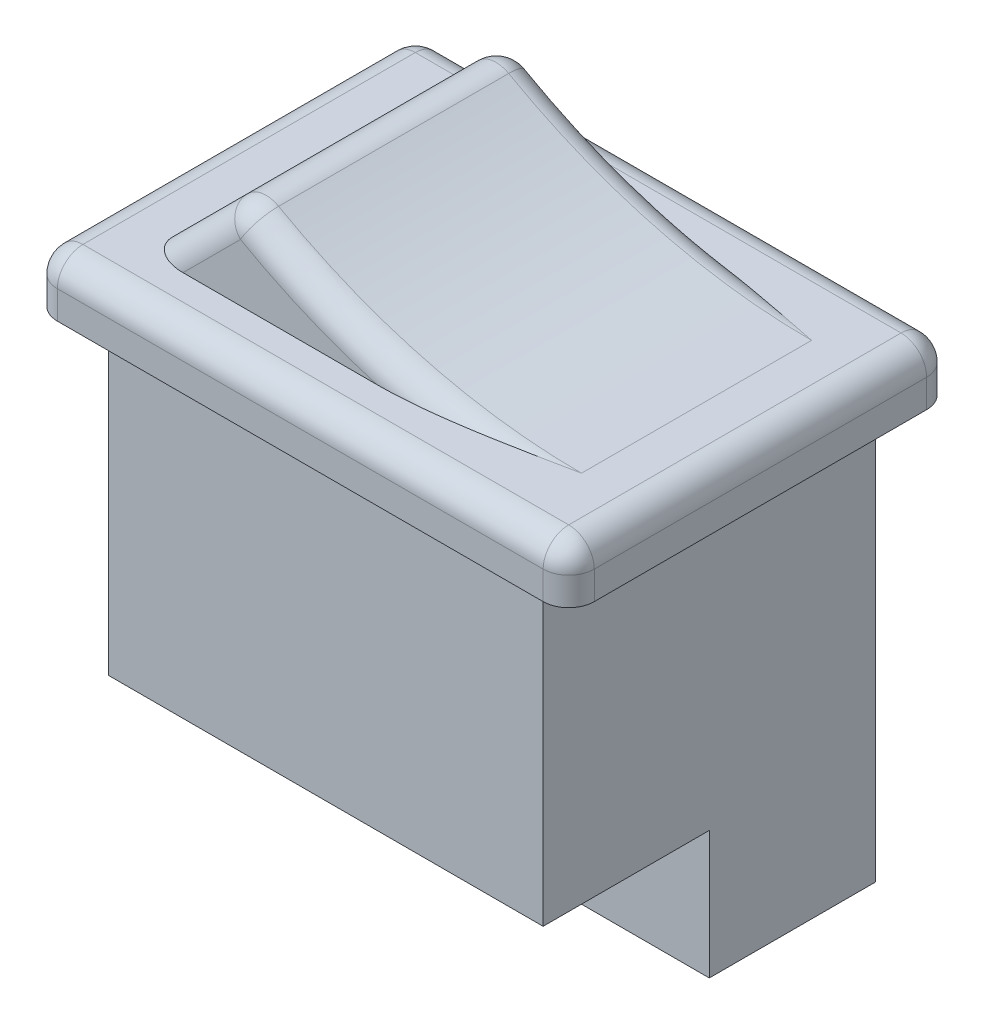
ISO-10303-21;
HEADER;
FILE_DESCRIPTION(('STEP AP214'),'2;1');
FILE_NAME('part.step','',(''),(''),'','','');
FILE_SCHEMA(('AUTOMOTIVE_DESIGN { 1 0 10303 214 1 1 1 1 }'));
ENDSEC;
DATA;
#1=APPLICATION_CONTEXT('core data for automotive mechanical design processes');
#2=APPLICATION_PROTOCOL_DEFINITION('international standard','automotive_design',2000,#1);
#3=PRODUCT_CONTEXT('',#1,'mechanical');
#4=PRODUCT('Part','Part','',(#3));
#5=PRODUCT_RELATED_PRODUCT_CATEGORY('part','',(#4));
#6=PRODUCT_DEFINITION_FORMATION('','',#4);
#7=PRODUCT_DEFINITION_CONTEXT('part definition',#1,'design');
#8=PRODUCT_DEFINITION('design','',#6,#7);
#9=PRODUCT_DEFINITION_SHAPE('','',#8);
#10=(LENGTH_UNIT() NAMED_UNIT(*) SI_UNIT(.MILLI.,.METRE.));
#11=(NAMED_UNIT(*) PLANE_ANGLE_UNIT() SI_UNIT($,.RADIAN.));
#12=(NAMED_UNIT(*) SI_UNIT($,.STERADIAN.) SOLID_ANGLE_UNIT());
#13=UNCERTAINTY_MEASURE_WITH_UNIT(LENGTH_MEASURE(1.E-05),#10,'distance_accuracy_value','');
#14=(GEOMETRIC_REPRESENTATION_CONTEXT(3) GLOBAL_UNCERTAINTY_ASSIGNED_CONTEXT((#13)) GLOBAL_UNIT_ASSIGNED_CONTEXT((#10,
#11,#12)) REPRESENTATION_CONTEXT('',''));
#15=CARTESIAN_POINT('',(0.,0.,0.));
#16=DIRECTION('',(0.,0.,1.));
#17=DIRECTION('',(1.,0.,0.));
#18=AXIS2_PLACEMENT_3D('',#15,#16,#17);
#19=CARTESIAN_POINT('',(0.,0.,0.));
#20=DIRECTION('',(0.,1.,0.));
#21=DIRECTION('',(0.,0.,1.));
#22=AXIS2_PLACEMENT_3D('',#19,#20,#21);
#23=PLANE('',#22);
#24=DIRECTION('',(1.,0.,0.));
#25=VECTOR('',#24,1.);
#26=CARTESIAN_POINT('',(-10.5,0.,7.5));
#27=LINE('',#26,#25);
#28=CARTESIAN_POINT('',(-9.5,0.,7.5));
#29=VERTEX_POINT('',#28);
#30=CARTESIAN_POINT('',(9.5,0.,7.5));
#31=VERTEX_POINT('',#30);
#32=EDGE_CURVE('E274',#29,#31,#27,.T.);
#33=ORIENTED_EDGE('',*,*,#32,.F.);
#34=CARTESIAN_POINT('',(-9.5,0.,6.5));
#35=DIRECTION('',(0.,1.,0.));
#36=DIRECTION('',(0.,0.,1.));
#37=AXIS2_PLACEMENT_3D('',#34,#35,#36);
#38=CIRCLE('',#37,1.);
#39=CARTESIAN_POINT('',(-10.5,0.,6.5));
#40=VERTEX_POINT('',#39);
#41=EDGE_CURVE('E11',#29,#40,#38,.F.);
#42=ORIENTED_EDGE('',*,*,#41,.T.);
#43=DIRECTION('',(0.,0.,1.));
#44=VECTOR('',#43,1.);
#45=CARTESIAN_POINT('',(-10.5,0.,-7.5));
#46=LINE('',#45,#44);
#47=CARTESIAN_POINT('',(-10.5,0.,-6.5));
#48=VERTEX_POINT('',#47);
#49=EDGE_CURVE('E271',#48,#40,#46,.T.);
#50=ORIENTED_EDGE('',*,*,#49,.F.);
#51=CARTESIAN_POINT('',(-9.5,0.,-6.5));
#52=DIRECTION('',(0.,1.,0.));
#53=DIRECTION('',(0.,0.,1.));
#54=AXIS2_PLACEMENT_3D('',#51,#52,#53);
#55=CIRCLE('',#54,1.);
#56=CARTESIAN_POINT('',(-9.5,0.,-7.5));
#57=VERTEX_POINT('',#56);
#58=EDGE_CURVE('E47',#48,#57,#55,.F.);
#59=ORIENTED_EDGE('',*,*,#58,.T.);
#60=DIRECTION('',(-1.,0.,0.));
#61=VECTOR('',#60,1.);
#62=CARTESIAN_POINT('',(-10.5,0.,-7.5));
#63=LINE('',#62,#61);
#64=CARTESIAN_POINT('',(9.5,0.,-7.5));
#65=VERTEX_POINT('',#64);
#66=EDGE_CURVE('E268',#65,#57,#63,.T.);
#67=ORIENTED_EDGE('',*,*,#66,.F.);
#68=CARTESIAN_POINT('',(9.5,0.,-6.5));
#69=DIRECTION('',(0.,1.,0.));
#70=DIRECTION('',(0.,0.,1.));
#71=AXIS2_PLACEMENT_3D('',#68,#69,#70);
#72=CIRCLE('',#71,1.);
#73=CARTESIAN_POINT('',(10.5,0.,-6.5));
#74=VERTEX_POINT('',#73);
#75=EDGE_CURVE('E418',#65,#74,#72,.F.);
#76=ORIENTED_EDGE('',*,*,#75,.T.);
#77=DIRECTION('',(0.,0.,-1.));
#78=VECTOR('',#77,1.);
#79=CARTESIAN_POINT('',(10.5,0.,-7.5));
#80=LINE('',#79,#78);
#81=CARTESIAN_POINT('',(10.5,0.,6.5));
#82=VERTEX_POINT('',#81);
#83=EDGE_CURVE('E265',#82,#74,#80,.T.);
#84=ORIENTED_EDGE('',*,*,#83,.F.);
#85=CARTESIAN_POINT('',(9.5,0.,6.5));
#86=DIRECTION('',(0.,1.,0.));
#87=DIRECTION('',(0.,0.,1.));
#88=AXIS2_PLACEMENT_3D('',#85,#86,#87);
#89=CIRCLE('',#88,1.);
#90=EDGE_CURVE('E416',#82,#31,#89,.F.);
#91=ORIENTED_EDGE('',*,*,#90,.T.);
#92=EDGE_LOOP('',(#33,#42,#50,#59,#67,#76,#84,#91));
#93=FACE_BOUND('',#92,.T.);
#94=DIRECTION('',(0.,0.,1.));
#95=VECTOR('',#94,1.);
#96=CARTESIAN_POINT('',(8.5,0.,6.5));
#97=LINE('',#96,#95);
#98=CARTESIAN_POINT('',(8.5,0.,-6.5));
#99=VERTEX_POINT('',#98);
#100=CARTESIAN_POINT('',(8.5,0.,6.5));
#101=VERTEX_POINT('',#100);
#102=EDGE_CURVE('E238',#99,#101,#97,.T.);
#103=ORIENTED_EDGE('',*,*,#102,.F.);
#104=DIRECTION('',(1.,0.,0.));
#105=VECTOR('',#104,1.);
#106=CARTESIAN_POINT('',(-8.5,0.,-6.5));
#107=LINE('',#106,#105);
#108=CARTESIAN_POINT('',(-8.5,0.,-6.5));
#109=VERTEX_POINT('',#108);
#110=EDGE_CURVE('E234',#109,#99,#107,.T.);
#111=ORIENTED_EDGE('',*,*,#110,.F.);
#112=DIRECTION('',(0.,0.,-1.));
#113=VECTOR('',#112,1.);
#114=CARTESIAN_POINT('',(-8.5,0.,6.5));
#115=LINE('',#114,#113);
#116=CARTESIAN_POINT('',(-8.5,0.,6.5));
#117=VERTEX_POINT('',#116);
#118=EDGE_CURVE('E202',#117,#109,#115,.T.);
#119=ORIENTED_EDGE('',*,*,#118,.F.);
#120=DIRECTION('',(-1.,0.,0.));
#121=VECTOR('',#120,1.);
#122=CARTESIAN_POINT('',(-8.5,0.,6.5));
#123=LINE('',#122,#121);
#124=EDGE_CURVE('E241',#101,#117,#123,.T.);
#125=ORIENTED_EDGE('',*,*,#124,.F.);
#126=EDGE_LOOP('',(#103,#111,#119,#125));
#127=FACE_BOUND('',#126,.T.);
#128=ADVANCED_FACE('F38',(#93,#127),#23,.F.);
#129=CARTESIAN_POINT('',(10.5,2.1,-7.5));
#130=DIRECTION('',(-1.,0.,0.));
#131=DIRECTION('',(0.,0.,1.));
#132=AXIS2_PLACEMENT_3D('',#129,#130,#131);
#133=PLANE('',#132);
#134=ORIENTED_EDGE('',*,*,#83,.T.);
#135=DIRECTION('',(0.,-1.,0.));
#136=VECTOR('',#135,1.);
#137=CARTESIAN_POINT('',(10.5,2.1,-6.5));
#138=LINE('',#137,#136);
#139=CARTESIAN_POINT('',(10.5,1.1,-6.5));
#140=VERTEX_POINT('',#139);
#141=EDGE_CURVE('E409',#74,#140,#138,.F.);
#142=ORIENTED_EDGE('',*,*,#141,.T.);
#143=DIRECTION('',(0.,0.,-1.));
#144=VECTOR('',#143,1.);
#145=CARTESIAN_POINT('',(10.5,1.1,7.5));
#146=LINE('',#145,#144);
#147=CARTESIAN_POINT('',(10.5,1.1,6.5));
#148=VERTEX_POINT('',#147);
#149=EDGE_CURVE('E407',#140,#148,#146,.F.);
#150=ORIENTED_EDGE('',*,*,#149,.T.);
#151=DIRECTION('',(0.,-1.,0.));
#152=VECTOR('',#151,1.);
#153=CARTESIAN_POINT('',(10.5,2.1,6.5));
#154=LINE('',#153,#152);
#155=EDGE_CURVE('E405',#148,#82,#154,.T.);
#156=ORIENTED_EDGE('',*,*,#155,.T.);
#157=EDGE_LOOP('',(#134,#142,#150,#156));
#158=FACE_BOUND('',#157,.T.);
#159=ADVANCED_FACE('F331',(#158),#133,.F.);
#160=CARTESIAN_POINT('',(-10.5,2.1,-7.5));
#161=DIRECTION('',(0.,0.,1.));
#162=DIRECTION('',(1.,0.,0.));
#163=AXIS2_PLACEMENT_3D('',#160,#161,#162);
#164=PLANE('',#163);
#165=ORIENTED_EDGE('',*,*,#66,.T.);
#166=DIRECTION('',(0.,-1.,0.));
#167=VECTOR('',#166,1.);
#168=CARTESIAN_POINT('',(-9.5,2.1,-7.5));
#169=LINE('',#168,#167);
#170=CARTESIAN_POINT('',(-9.5,1.1,-7.5));
#171=VERTEX_POINT('',#170);
#172=EDGE_CURVE('E403',#57,#171,#169,.F.);
#173=ORIENTED_EDGE('',*,*,#172,.T.);
#174=DIRECTION('',(-1.,0.,0.));
#175=VECTOR('',#174,1.);
#176=CARTESIAN_POINT('',(10.5,1.1,-7.5));
#177=LINE('',#176,#175);
#178=CARTESIAN_POINT('',(9.5,1.1,-7.5));
#179=VERTEX_POINT('',#178);
#180=EDGE_CURVE('E401',#171,#179,#177,.F.);
#181=ORIENTED_EDGE('',*,*,#180,.T.);
#182=DIRECTION('',(0.,-1.,0.));
#183=VECTOR('',#182,1.);
#184=CARTESIAN_POINT('',(9.5,2.1,-7.5));
#185=LINE('',#184,#183);
#186=EDGE_CURVE('E399',#179,#65,#185,.T.);
#187=ORIENTED_EDGE('',*,*,#186,.T.);
#188=EDGE_LOOP('',(#165,#173,#181,#187));
#189=FACE_BOUND('',#188,.T.);
#190=ADVANCED_FACE('F338',(#189),#164,.F.);
#191=CARTESIAN_POINT('',(-10.5,2.1,-7.5));
#192=DIRECTION('',(1.,0.,0.));
#193=DIRECTION('',(0.,0.,-1.));
#194=AXIS2_PLACEMENT_3D('',#191,#192,#193);
#195=PLANE('',#194);
#196=ORIENTED_EDGE('',*,*,#49,.T.);
#197=DIRECTION('',(0.,-1.,0.));
#198=VECTOR('',#197,1.);
#199=CARTESIAN_POINT('',(-10.5,2.1,6.5));
#200=LINE('',#199,#198);
#201=CARTESIAN_POINT('',(-10.5,1.1,6.5));
#202=VERTEX_POINT('',#201);
#203=EDGE_CURVE('E397',#40,#202,#200,.F.);
#204=ORIENTED_EDGE('',*,*,#203,.T.);
#205=DIRECTION('',(0.,0.,1.));
#206=VECTOR('',#205,1.);
#207=CARTESIAN_POINT('',(-10.5,1.1,-7.5));
#208=LINE('',#207,#206);
#209=CARTESIAN_POINT('',(-10.5,1.1,-6.5));
#210=VERTEX_POINT('',#209);
#211=EDGE_CURVE('E394',#202,#210,#208,.F.);
#212=ORIENTED_EDGE('',*,*,#211,.T.);
#213=DIRECTION('',(0.,-1.,0.));
#214=VECTOR('',#213,1.);
#215=CARTESIAN_POINT('',(-10.5,2.1,-6.5));
#216=LINE('',#215,#214);
#217=EDGE_CURVE('E392',#210,#48,#216,.T.);
#218=ORIENTED_EDGE('',*,*,#217,.T.);
#219=EDGE_LOOP('',(#196,#204,#212,#218));
#220=FACE_BOUND('',#219,.T.);
#221=ADVANCED_FACE('F335',(#220),#195,.F.);
#222=CARTESIAN_POINT('',(-10.5,2.1,7.5));
#223=DIRECTION('',(0.,0.,-1.));
#224=DIRECTION('',(-1.,0.,0.));
#225=AXIS2_PLACEMENT_3D('',#222,#223,#224);
#226=PLANE('',#225);
#227=DIRECTION('',(1.,0.,0.));
#228=VECTOR('',#227,1.);
#229=CARTESIAN_POINT('',(-10.5,1.1,7.5));
#230=LINE('',#229,#228);
#231=CARTESIAN_POINT('',(9.5,1.1,7.5));
#232=VERTEX_POINT('',#231);
#233=CARTESIAN_POINT('',(-9.5,1.1,7.5));
#234=VERTEX_POINT('',#233);
#235=EDGE_CURVE('E63',#232,#234,#230,.F.);
#236=ORIENTED_EDGE('',*,*,#235,.T.);
#237=DIRECTION('',(0.,-1.,0.));
#238=VECTOR('',#237,1.);
#239=CARTESIAN_POINT('',(-9.5,2.1,7.5));
#240=LINE('',#239,#238);
#241=EDGE_CURVE('E414',#234,#29,#240,.T.);
#242=ORIENTED_EDGE('',*,*,#241,.T.);
#243=ORIENTED_EDGE('',*,*,#32,.T.);
#244=DIRECTION('',(0.,-1.,0.));
#245=VECTOR('',#244,1.);
#246=CARTESIAN_POINT('',(9.50000000000001,2.1,7.5));
#247=LINE('',#246,#245);
#248=EDGE_CURVE('E411',#31,#232,#247,.F.);
#249=ORIENTED_EDGE('',*,*,#248,.T.);
#250=EDGE_LOOP('',(#236,#242,#243,#249));
#251=FACE_BOUND('',#250,.T.);
#252=ADVANCED_FACE('F325',(#251),#226,.F.);
#253=CARTESIAN_POINT('',(0.,2.1,0.));
#254=DIRECTION('',(0.,1.,0.));
#255=DIRECTION('',(0.,0.,1.));
#256=AXIS2_PLACEMENT_3D('',#253,#254,#255);
#257=PLANE('',#256);
#258=DIRECTION('',(-1.,0.,0.));
#259=VECTOR('',#258,1.);
#260=CARTESIAN_POINT('',(-10.5,2.1,-6.5));
#261=LINE('',#260,#259);
#262=CARTESIAN_POINT('',(9.5,2.1,-6.5));
#263=VERTEX_POINT('',#262);
#264=CARTESIAN_POINT('',(-9.5,2.1,-6.5));
#265=VERTEX_POINT('',#264);
#266=EDGE_CURVE('E387',#263,#265,#261,.T.);
#267=ORIENTED_EDGE('',*,*,#266,.T.);
#268=DIRECTION('',(0.,0.,1.));
#269=VECTOR('',#268,1.);
#270=CARTESIAN_POINT('',(-9.5,2.1,7.5));
#271=LINE('',#270,#269);
#272=CARTESIAN_POINT('',(-9.5,2.1,6.5));
#273=VERTEX_POINT('',#272);
#274=EDGE_CURVE('E389',#265,#273,#271,.T.);
#275=ORIENTED_EDGE('',*,*,#274,.T.);
#276=DIRECTION('',(1.,0.,0.));
#277=VECTOR('',#276,1.);
#278=CARTESIAN_POINT('',(10.5,2.1,6.5));
#279=LINE('',#278,#277);
#280=CARTESIAN_POINT('',(9.50000000000001,2.1,6.5));
#281=VERTEX_POINT('',#280);
#282=EDGE_CURVE('E382',#273,#281,#279,.T.);
#283=ORIENTED_EDGE('',*,*,#282,.T.);
#284=DIRECTION('',(0.,0.,-1.));
#285=VECTOR('',#284,1.);
#286=CARTESIAN_POINT('',(9.5,2.1,-7.5));
#287=LINE('',#286,#285);
#288=EDGE_CURVE('E384',#281,#263,#287,.T.);
#289=ORIENTED_EDGE('',*,*,#288,.T.);
#290=EDGE_LOOP('',(#267,#275,#283,#289));
#291=FACE_BOUND('',#290,.T.);
#292=DIRECTION('',(1.,0.,0.));
#293=VECTOR('',#292,1.);
#294=CARTESIAN_POINT('',(-8.,2.1,5.5));
#295=LINE('',#294,#293);
#296=CARTESIAN_POINT('',(-6.5857864376269,2.1,5.5));
#297=VERTEX_POINT('',#296);
#298=CARTESIAN_POINT('',(0.989803344922675,2.1,5.5));
#299=VERTEX_POINT('',#298);
#300=EDGE_CURVE('E252',#297,#299,#295,.T.);
#301=ORIENTED_EDGE('',*,*,#300,.F.);
#302=CARTESIAN_POINT('',(-6.5857864376269,2.1,4.5));
#303=DIRECTION('',(0.,1.,0.));
#304=DIRECTION('',(1.,0.,0.));
#305=AXIS2_PLACEMENT_3D('',#302,#303,#304);
#306=ELLIPSE('',#305,1.41421356237309,1.);
#307=CARTESIAN_POINT('',(-8.,2.1,4.5));
#308=VERTEX_POINT('',#307);
#309=EDGE_CURVE('E385',#297,#308,#306,.F.);
#310=ORIENTED_EDGE('',*,*,#309,.T.);
#311=DIRECTION('',(0.,0.,-1.));
#312=VECTOR('',#311,1.);
#313=CARTESIAN_POINT('',(-8.,2.1,5.5));
#314=LINE('',#313,#312);
#315=CARTESIAN_POINT('',(-8.,2.1,-4.5));
#316=VERTEX_POINT('',#315);
#317=EDGE_CURVE('E255',#308,#316,#314,.T.);
#318=ORIENTED_EDGE('',*,*,#317,.T.);
#319=CARTESIAN_POINT('',(-6.5857864376269,2.1,-4.5));
#320=DIRECTION('',(0.,1.,0.));
#321=DIRECTION('',(-1.,0.,0.));
#322=AXIS2_PLACEMENT_3D('',#319,#320,#321);
#323=ELLIPSE('',#322,1.41421356237309,1.);
#324=CARTESIAN_POINT('',(-6.5857864376269,2.1,-5.5));
#325=VERTEX_POINT('',#324);
#326=EDGE_CURVE('E298',#316,#325,#323,.F.);
#327=ORIENTED_EDGE('',*,*,#326,.T.);
#328=DIRECTION('',(1.,0.,0.));
#329=VECTOR('',#328,1.);
#330=CARTESIAN_POINT('',(-8.,2.1,-5.5));
#331=LINE('',#330,#329);
#332=CARTESIAN_POINT('',(0.989803344922675,2.1,-5.5));
#333=VERTEX_POINT('',#332);
#334=EDGE_CURVE('E256',#325,#333,#331,.T.);
#335=ORIENTED_EDGE('',*,*,#334,.T.);
#336=CARTESIAN_POINT('',(0.989803344922675,2.1,-5.5));
#337=CARTESIAN_POINT('',(1.15710599464306,2.1,-5.49995319820799));
#338=CARTESIAN_POINT('',(1.3243738238347,2.1,-5.4967204852626));
#339=CARTESIAN_POINT('',(1.65866424734852,2.1,-5.48479834075375));
#340=CARTESIAN_POINT('',(1.82568690464956,2.1,-5.47611072108879));
#341=CARTESIAN_POINT('',(2.15909185638666,2.1,-5.45421434667783));
#342=CARTESIAN_POINT('',(2.32547476389693,2.1,-5.44101458817882));
#343=CARTESIAN_POINT('',(2.65790163532321,2.1,-5.41075789181084));
#344=CARTESIAN_POINT('',(2.8239455652801,2.1,-5.39370058494724));
#345=CARTESIAN_POINT('',(3.19902837795923,2.1,-5.35141340788228));
#346=CARTESIAN_POINT('',(3.40795718759072,2.1,-5.32521280884506));
#347=CARTESIAN_POINT('',(3.82523777700711,2.1,-5.2685337023765));
#348=CARTESIAN_POINT('',(4.03358952396676,2.1,-5.23805495648712));
#349=CARTESIAN_POINT('',(4.65789215295781,2.1,-5.14141038172278));
#350=CARTESIAN_POINT('',(5.07303476437981,2.09999999999999,-5.07004294252252));
#351=CARTESIAN_POINT('',(6.31695679251964,2.10000000000001,-4.84303251154035));
#352=CARTESIAN_POINT('',(7.14332239162398,2.10000000000007,-4.67460887017226));
#353=CARTESIAN_POINT('',(7.97973013342416,2.1,-4.50413139533151));
#354=CARTESIAN_POINT('',(7.9898650708118,2.1,-4.50206568104853));
#355=CARTESIAN_POINT('',(8.,2.1,-4.5));
#356=B_SPLINE_CURVE_WITH_KNOTS('',3,(#336,#337,#338,#339,#340,#341,#342,#343,#344,#345,#346,
#347,#348,#349,#350,#351,#352,#353,#354,#355),.UNSPECIFIED.,.F.,.F.,(4,2,2,2,2,2,2,2,2,4),(0.,
0.501828542780309,1.00349048661041,1.50415800107623,2.00487342727357,2.63651218316322,
3.26818615972301,4.53170220520794,7.06148195229178,7.0925118917517),.UNSPECIFIED.);
#357=CARTESIAN_POINT('',(8.,2.1,-4.5));
#358=VERTEX_POINT('',#357);
#359=EDGE_CURVE('E300',#333,#358,#356,.T.);
#360=ORIENTED_EDGE('',*,*,#359,.T.);
#361=DIRECTION('',(0.,0.,-1.));
#362=VECTOR('',#361,1.);
#363=CARTESIAN_POINT('',(8.,2.1,5.5));
#364=LINE('',#363,#362);
#365=CARTESIAN_POINT('',(8.,2.1,4.5));
#366=VERTEX_POINT('',#365);
#367=EDGE_CURVE('E262',#366,#358,#364,.T.);
#368=ORIENTED_EDGE('',*,*,#367,.F.);
#369=CARTESIAN_POINT('',(0.989803344922675,2.1,5.5));
#370=CARTESIAN_POINT('',(1.15710599464306,2.1,5.49995319820799));
#371=CARTESIAN_POINT('',(1.3243738238347,2.1,5.4967204852626));
#372=CARTESIAN_POINT('',(1.65866424734852,2.1,5.48479834075375));
#373=CARTESIAN_POINT('',(1.82568690464956,2.1,5.47611072108879));
#374=CARTESIAN_POINT('',(2.15909185638666,2.1,5.45421434667783));
#375=CARTESIAN_POINT('',(2.32547476389693,2.1,5.44101458817882));
#376=CARTESIAN_POINT('',(2.65790163532321,2.1,5.41075789181084));
#377=CARTESIAN_POINT('',(2.8239455652801,2.1,5.39370058494724));
#378=CARTESIAN_POINT('',(3.19902837795923,2.1,5.35141340788228));
#379=CARTESIAN_POINT('',(3.40795718759072,2.1,5.32521280884506));
#380=CARTESIAN_POINT('',(3.82523777700711,2.1,5.2685337023765));
#381=CARTESIAN_POINT('',(4.03358952396676,2.1,5.23805495648712));
#382=CARTESIAN_POINT('',(4.65789215295781,2.1,5.14141038172278));
#383=CARTESIAN_POINT('',(5.07303476437981,2.09999999999999,5.07004294252252));
#384=CARTESIAN_POINT('',(6.31695679251964,2.10000000000001,4.84303251154035));
#385=CARTESIAN_POINT('',(7.14332239162398,2.10000000000007,4.67460887017227));
#386=CARTESIAN_POINT('',(7.97973013342416,2.1,4.50413139533151));
#387=CARTESIAN_POINT('',(7.9898650708118,2.1,4.50206568104853));
#388=CARTESIAN_POINT('',(8.,2.1,4.5));
#389=B_SPLINE_CURVE_WITH_KNOTS('',3,(#369,#370,#371,#372,#373,#374,#375,#376,#377,#378,#379,
#380,#381,#382,#383,#384,#385,#386,#387,#388),.UNSPECIFIED.,.F.,.F.,(4,2,2,2,2,2,2,2,2,4),(0.,
0.501828542780309,1.00349048661041,1.50415800107623,2.00487342727357,2.63651218316322,
3.26818615972301,4.53170220520794,7.06148195229178,7.0925118917517),.UNSPECIFIED.);
#390=EDGE_CURVE('E308',#366,#299,#389,.F.);
#391=ORIENTED_EDGE('',*,*,#390,.T.);
#392=EDGE_LOOP('',(#301,#310,#318,#327,#335,#360,#368,#391));
#393=FACE_BOUND('',#392,.T.);
#394=ADVANCED_FACE('F319',(#291,#393),#257,.T.);
#395=CARTESIAN_POINT('',(8.,26.1714285714286,5.5));
#396=DIRECTION('',(0.,0.,-1.));
#397=DIRECTION('',(-1.,0.,0.));
#398=AXIS2_PLACEMENT_3D('',#395,#396,#397);
#399=CYLINDRICAL_SURFACE('',#398,24.0714285714286);
#400=ORIENTED_EDGE('',*,*,#367,.T.);
#401=CARTESIAN_POINT('',(8.,26.1714285714286,-4.5));
#402=DIRECTION('',(0.,0.,1.));
#403=DIRECTION('',(1.,0.,0.));
#404=AXIS2_PLACEMENT_3D('',#401,#402,#403);
#405=CIRCLE('',#404,24.0714285714286);
#406=CARTESIAN_POINT('',(-3.84699517619381,5.21713596192661,-4.5));
#407=VERTEX_POINT('',#406);
#408=EDGE_CURVE('E292',#358,#407,#405,.F.);
#409=ORIENTED_EDGE('',*,*,#408,.T.);
#410=DIRECTION('',(0.,0.,-1.));
#411=VECTOR('',#410,1.);
#412=CARTESIAN_POINT('',(-3.84699517619381,5.21713596192661,5.5));
#413=LINE('',#412,#411);
#414=CARTESIAN_POINT('',(-3.84699517619381,5.21713596192661,4.5));
#415=VERTEX_POINT('',#414);
#416=EDGE_CURVE('E288',#407,#415,#413,.F.);
#417=ORIENTED_EDGE('',*,*,#416,.T.);
#418=CARTESIAN_POINT('',(8.,26.1714285714286,4.5));
#419=DIRECTION('',(0.,0.,1.));
#420=DIRECTION('',(1.,0.,0.));
#421=AXIS2_PLACEMENT_3D('',#418,#419,#420);
#422=CIRCLE('',#421,24.0714285714286);
#423=EDGE_CURVE('E290',#415,#366,#422,.T.);
#424=ORIENTED_EDGE('',*,*,#423,.T.);
#425=EDGE_LOOP('',(#400,#409,#417,#424));
#426=FACE_BOUND('',#425,.T.);
#427=ADVANCED_FACE('F324',(#426),#399,.F.);
#428=CARTESIAN_POINT('',(-8.,2.1,5.5));
#429=DIRECTION('',(0.707106781186548,-0.707106781186547,0.));
#430=DIRECTION('',(0.707106781186547,0.707106781186548,0.));
#431=AXIS2_PLACEMENT_3D('',#428,#429,#430);
#432=PLANE('',#431);
#433=DIRECTION('',(0.,0.,-1.));
#434=VECTOR('',#433,1.);
#435=CARTESIAN_POINT('',(-5.04626199437357,5.05373800562643,5.5));
#436=LINE('',#435,#434);
#437=CARTESIAN_POINT('',(-5.04626199437357,5.05373800562643,4.5));
#438=VERTEX_POINT('',#437);
#439=CARTESIAN_POINT('',(-5.04626199437357,5.05373800562643,-4.5));
#440=VERTEX_POINT('',#439);
#441=EDGE_CURVE('E277',#438,#440,#436,.T.);
#442=ORIENTED_EDGE('',*,*,#441,.T.);
#443=DIRECTION('',(-0.707106781186547,-0.707106781186548,0.));
#444=VECTOR('',#443,1.);
#445=CARTESIAN_POINT('',(-8.,2.1,-4.5));
#446=LINE('',#445,#444);
#447=EDGE_CURVE('E281',#440,#316,#446,.T.);
#448=ORIENTED_EDGE('',*,*,#447,.T.);
#449=ORIENTED_EDGE('',*,*,#317,.F.);
#450=DIRECTION('',(-0.707106781186547,-0.707106781186548,0.));
#451=VECTOR('',#450,1.);
#452=CARTESIAN_POINT('',(-4.5,5.6,4.5));
#453=LINE('',#452,#451);
#454=EDGE_CURVE('E279',#308,#438,#453,.F.);
#455=ORIENTED_EDGE('',*,*,#454,.T.);
#456=EDGE_LOOP('',(#442,#448,#449,#455));
#457=FACE_BOUND('',#456,.T.);
#458=ADVANCED_FACE('F533',(#457),#432,.F.);
#459=CARTESIAN_POINT('',(8.,26.1714285714286,5.5));
#460=DIRECTION('',(0.,0.,1.));
#461=DIRECTION('',(1.,0.,0.));
#462=AXIS2_PLACEMENT_3D('',#459,#460,#461);
#463=PLANE('',#462);
#464=ORIENTED_EDGE('',*,*,#300,.T.);
#465=CARTESIAN_POINT('',(8.,26.1714285714286,5.5));
#466=DIRECTION('',(0.,0.,1.));
#467=DIRECTION('',(1.,0.,0.));
#468=AXIS2_PLACEMENT_3D('',#465,#466,#467);
#469=CIRCLE('',#468,25.0714285714286);
#470=CARTESIAN_POINT('',(-4.33915521318702,4.34663122443988,5.5));
#471=VERTEX_POINT('',#470);
#472=EDGE_CURVE('E296',#299,#471,#469,.F.);
#473=ORIENTED_EDGE('',*,*,#472,.T.);
#474=DIRECTION('',(-0.707106781186547,-0.707106781186548,0.));
#475=VECTOR('',#474,1.);
#476=CARTESIAN_POINT('',(-7.29289321881345,1.39289321881345,5.5));
#477=LINE('',#476,#475);
#478=EDGE_CURVE('E294',#471,#297,#477,.T.);
#479=ORIENTED_EDGE('',*,*,#478,.T.);
#480=EDGE_LOOP('',(#464,#473,#479));
#481=FACE_BOUND('',#480,.T.);
#482=ADVANCED_FACE('F529',(#481),#463,.T.);
#483=CARTESIAN_POINT('',(8.,26.1714285714286,-5.5));
#484=DIRECTION('',(0.,0.,1.));
#485=DIRECTION('',(1.,0.,0.));
#486=AXIS2_PLACEMENT_3D('',#483,#484,#485);
#487=PLANE('',#486);
#488=ORIENTED_EDGE('',*,*,#334,.F.);
#489=DIRECTION('',(-0.707106781186547,-0.707106781186548,0.));
#490=VECTOR('',#489,1.);
#491=CARTESIAN_POINT('',(12.7428210669008,21.4286075045277,-5.5));
#492=LINE('',#491,#490);
#493=CARTESIAN_POINT('',(-4.33915521318702,4.34663122443988,-5.5));
#494=VERTEX_POINT('',#493);
#495=EDGE_CURVE('E286',#325,#494,#492,.F.);
#496=ORIENTED_EDGE('',*,*,#495,.T.);
#497=CARTESIAN_POINT('',(8.,26.1714285714286,-5.5));
#498=DIRECTION('',(0.,0.,1.));
#499=DIRECTION('',(1.,0.,0.));
#500=AXIS2_PLACEMENT_3D('',#497,#498,#499);
#501=CIRCLE('',#500,25.0714285714286);
#502=EDGE_CURVE('E284',#494,#333,#501,.T.);
#503=ORIENTED_EDGE('',*,*,#502,.T.);
#504=EDGE_LOOP('',(#488,#496,#503));
#505=FACE_BOUND('',#504,.T.);
#506=ADVANCED_FACE('F532',(#505),#487,.F.);
#507=CARTESIAN_POINT('',(8.,26.1714285714286,4.5));
#508=DIRECTION('',(0.,0.,1.));
#509=DIRECTION('',(1.,0.,0.));
#510=AXIS2_PLACEMENT_3D('',#507,#508,#509);
#511=TOROIDAL_SURFACE('',#510,25.0714285714286,1.);
#512=ORIENTED_EDGE('',*,*,#390,.F.);
#513=ORIENTED_EDGE('',*,*,#423,.F.);
#514=CARTESIAN_POINT('',(-4.33915521318702,4.34663122443988,4.5));
#515=DIRECTION('',(-0.870504737486729,0.492160036993214,0.));
#516=DIRECTION('',(-0.492160036993214,-0.870504737486729,0.));
#517=AXIS2_PLACEMENT_3D('',#514,#515,#516);
#518=CIRCLE('',#517,1.);
#519=EDGE_CURVE('E259',#471,#415,#518,.T.);
#520=ORIENTED_EDGE('',*,*,#519,.F.);
#521=ORIENTED_EDGE('',*,*,#472,.F.);
#522=EDGE_LOOP('',(#512,#513,#520,#521));
#523=FACE_BOUND('',#522,.T.);
#524=ADVANCED_FACE('F536',(#523),#511,.T.);
#525=CARTESIAN_POINT('',(12.7428210669008,21.4286075045277,4.5));
#526=DIRECTION('',(0.707106781186547,0.707106781186548,0.));
#527=DIRECTION('',(-0.707106781186548,0.707106781186547,0.));
#528=AXIS2_PLACEMENT_3D('',#525,#526,#527);
#529=CYLINDRICAL_SURFACE('',#528,1.);
#530=ORIENTED_EDGE('',*,*,#309,.F.);
#531=ORIENTED_EDGE('',*,*,#478,.F.);
#532=CARTESIAN_POINT('',(-4.33915521318703,4.34663122443988,4.5));
#533=DIRECTION('',(0.707106781186548,0.707106781186548,0.));
#534=DIRECTION('',(-0.707106781186548,0.707106781186548,0.));
#535=AXIS2_PLACEMENT_3D('',#532,#533,#534);
#536=CIRCLE('',#535,1.);
#537=EDGE_CURVE('E372',#438,#471,#536,.T.);
#538=ORIENTED_EDGE('',*,*,#537,.F.);
#539=ORIENTED_EDGE('',*,*,#454,.F.);
#540=EDGE_LOOP('',(#530,#531,#538,#539));
#541=FACE_BOUND('',#540,.T.);
#542=ADVANCED_FACE('F567',(#541),#529,.T.);
#543=CARTESIAN_POINT('',(-4.33915521318702,4.34663122443988,4.5));
#544=DIRECTION('',(0.,0.,1.));
#545=DIRECTION('',(1.,0.,0.));
#546=AXIS2_PLACEMENT_3D('',#543,#544,#545);
#547=SPHERICAL_SURFACE('',#546,1.);
#548=ORIENTED_EDGE('',*,*,#537,.T.);
#549=ORIENTED_EDGE('',*,*,#519,.T.);
#550=CARTESIAN_POINT('',(-4.33915521318702,4.34663122443988,4.5));
#551=DIRECTION('',(0.,0.,1.));
#552=DIRECTION('',(1.,0.,0.));
#553=AXIS2_PLACEMENT_3D('',#550,#551,#552);
#554=CIRCLE('',#553,1.);
#555=EDGE_CURVE('E366',#438,#415,#554,.F.);
#556=ORIENTED_EDGE('',*,*,#555,.F.);
#557=EDGE_LOOP('',(#548,#549,#556));
#558=FACE_BOUND('',#557,.T.);
#559=ADVANCED_FACE('F360',(#558),#547,.T.);
#560=CARTESIAN_POINT('',(8.,26.1714285714286,-4.5));
#561=DIRECTION('',(0.,0.,1.));
#562=DIRECTION('',(1.,0.,0.));
#563=AXIS2_PLACEMENT_3D('',#560,#561,#562);
#564=TOROIDAL_SURFACE('',#563,25.0714285714286,1.);
#565=ORIENTED_EDGE('',*,*,#359,.F.);
#566=ORIENTED_EDGE('',*,*,#502,.F.);
#567=CARTESIAN_POINT('',(-4.33915521318702,4.34663122443988,-4.5));
#568=DIRECTION('',(-0.870504737486728,0.492160036993214,0.));
#569=DIRECTION('',(-0.492160036993214,-0.870504737486728,0.));
#570=AXIS2_PLACEMENT_3D('',#567,#568,#569);
#571=CIRCLE('',#570,1.);
#572=EDGE_CURVE('E373',#407,#494,#571,.T.);
#573=ORIENTED_EDGE('',*,*,#572,.F.);
#574=ORIENTED_EDGE('',*,*,#408,.F.);
#575=EDGE_LOOP('',(#565,#566,#573,#574));
#576=FACE_BOUND('',#575,.T.);
#577=ADVANCED_FACE('F315',(#576),#564,.T.);
#578=CARTESIAN_POINT('',(-4.33915521318702,4.34663122443988,5.5));
#579=DIRECTION('',(0.,0.,-1.));
#580=DIRECTION('',(-1.,0.,0.));
#581=AXIS2_PLACEMENT_3D('',#578,#579,#580);
#582=CYLINDRICAL_SURFACE('',#581,1.);
#583=ORIENTED_EDGE('',*,*,#555,.T.);
#584=ORIENTED_EDGE('',*,*,#416,.F.);
#585=CARTESIAN_POINT('',(-4.33915521318703,4.34663122443988,-4.5));
#586=DIRECTION('',(0.,0.,-1.));
#587=DIRECTION('',(-1.,0.,0.));
#588=AXIS2_PLACEMENT_3D('',#585,#586,#587);
#589=CIRCLE('',#588,1.);
#590=EDGE_CURVE('E377',#440,#407,#589,.T.);
#591=ORIENTED_EDGE('',*,*,#590,.F.);
#592=ORIENTED_EDGE('',*,*,#441,.F.);
#593=EDGE_LOOP('',(#583,#584,#591,#592));
#594=FACE_BOUND('',#593,.T.);
#595=ADVANCED_FACE('F353',(#594),#582,.T.);
#596=CARTESIAN_POINT('',(-4.33915521318702,4.34663122443988,-4.5));
#597=DIRECTION('',(0.,0.,1.));
#598=DIRECTION('',(1.,0.,0.));
#599=AXIS2_PLACEMENT_3D('',#596,#597,#598);
#600=SPHERICAL_SURFACE('',#599,1.);
#601=ORIENTED_EDGE('',*,*,#590,.T.);
#602=ORIENTED_EDGE('',*,*,#572,.T.);
#603=CARTESIAN_POINT('',(-4.33915521318702,4.34663122443988,-4.5));
#604=DIRECTION('',(0.707106781186542,0.707106781186553,0.));
#605=DIRECTION('',(-0.707106781186553,0.707106781186542,0.));
#606=AXIS2_PLACEMENT_3D('',#603,#604,#605);
#607=CIRCLE('',#606,1.);
#608=EDGE_CURVE('E251',#440,#494,#607,.F.);
#609=ORIENTED_EDGE('',*,*,#608,.F.);
#610=EDGE_LOOP('',(#601,#602,#609));
#611=FACE_BOUND('',#610,.T.);
#612=ADVANCED_FACE('F350',(#611),#600,.T.);
#613=CARTESIAN_POINT('',(-7.29289321881345,1.39289321881345,-4.5));
#614=DIRECTION('',(-0.707106781186547,-0.707106781186548,0.));
#615=DIRECTION('',(0.707106781186548,-0.707106781186547,0.));
#616=AXIS2_PLACEMENT_3D('',#613,#614,#615);
#617=CYLINDRICAL_SURFACE('',#616,1.);
#618=ORIENTED_EDGE('',*,*,#608,.T.);
#619=ORIENTED_EDGE('',*,*,#495,.F.);
#620=ORIENTED_EDGE('',*,*,#326,.F.);
#621=ORIENTED_EDGE('',*,*,#447,.F.);
#622=EDGE_LOOP('',(#618,#619,#620,#621));
#623=FACE_BOUND('',#622,.T.);
#624=ADVANCED_FACE('F346',(#623),#617,.T.);
#625=CARTESIAN_POINT('',(8.5,-12.,6.5));
#626=DIRECTION('',(-1.,0.,0.));
#627=DIRECTION('',(0.,0.,1.));
#628=AXIS2_PLACEMENT_3D('',#625,#626,#627);
#629=PLANE('',#628);
#630=ORIENTED_EDGE('',*,*,#102,.T.);
#631=DIRECTION('',(0.,1.,0.));
#632=VECTOR('',#631,1.);
#633=CARTESIAN_POINT('',(8.5,-12.,6.5));
#634=LINE('',#633,#632);
#635=CARTESIAN_POINT('',(8.5,-12.,6.5));
#636=VERTEX_POINT('',#635);
#637=EDGE_CURVE('E248',#636,#101,#634,.T.);
#638=ORIENTED_EDGE('',*,*,#637,.F.);
#639=DIRECTION('',(0.,0.,1.));
#640=VECTOR('',#639,1.);
#641=CARTESIAN_POINT('',(8.5,-12.,6.5));
#642=LINE('',#641,#640);
#643=CARTESIAN_POINT('',(8.5,-12.,0.));
#644=VERTEX_POINT('',#643);
#645=EDGE_CURVE('E231',#644,#636,#642,.T.);
#646=ORIENTED_EDGE('',*,*,#645,.F.);
#647=DIRECTION('',(0.,1.,0.));
#648=VECTOR('',#647,1.);
#649=CARTESIAN_POINT('',(8.5,-17.,0.));
#650=LINE('',#649,#648);
#651=CARTESIAN_POINT('',(8.5,-17.,0.));
#652=VERTEX_POINT('',#651);
#653=EDGE_CURVE('E227',#652,#644,#650,.T.);
#654=ORIENTED_EDGE('',*,*,#653,.F.);
#655=DIRECTION('',(0.,0.,1.));
#656=VECTOR('',#655,1.);
#657=CARTESIAN_POINT('',(8.5,-17.,-6.5));
#658=LINE('',#657,#656);
#659=CARTESIAN_POINT('',(8.5,-17.,-6.5));
#660=VERTEX_POINT('',#659);
#661=EDGE_CURVE('E214',#660,#652,#658,.T.);
#662=ORIENTED_EDGE('',*,*,#661,.F.);
#663=DIRECTION('',(0.,1.,0.));
#664=VECTOR('',#663,1.);
#665=CARTESIAN_POINT('',(8.5,-12.,-6.5));
#666=LINE('',#665,#664);
#667=EDGE_CURVE('E206',#660,#99,#666,.T.);
#668=ORIENTED_EDGE('',*,*,#667,.T.);
#669=EDGE_LOOP('',(#630,#638,#646,#654,#662,#668));
#670=FACE_BOUND('',#669,.T.);
#671=ADVANCED_FACE('F349',(#670),#629,.F.);
#672=CARTESIAN_POINT('',(-8.5,-12.,6.5));
#673=DIRECTION('',(0.,0.,-1.));
#674=DIRECTION('',(-1.,0.,0.));
#675=AXIS2_PLACEMENT_3D('',#672,#673,#674);
#676=PLANE('',#675);
#677=ORIENTED_EDGE('',*,*,#124,.T.);
#678=DIRECTION('',(0.,1.,0.));
#679=VECTOR('',#678,1.);
#680=CARTESIAN_POINT('',(-8.5,-12.,6.5));
#681=LINE('',#680,#679);
#682=CARTESIAN_POINT('',(-8.5,-12.,6.5));
#683=VERTEX_POINT('',#682);
#684=EDGE_CURVE('E205',#683,#117,#681,.T.);
#685=ORIENTED_EDGE('',*,*,#684,.F.);
#686=DIRECTION('',(-1.,0.,0.));
#687=VECTOR('',#686,1.);
#688=CARTESIAN_POINT('',(-8.5,-12.,6.5));
#689=LINE('',#688,#687);
#690=EDGE_CURVE('E233',#636,#683,#689,.T.);
#691=ORIENTED_EDGE('',*,*,#690,.F.);
#692=ORIENTED_EDGE('',*,*,#637,.T.);
#693=EDGE_LOOP('',(#677,#685,#691,#692));
#694=FACE_BOUND('',#693,.T.);
#695=ADVANCED_FACE('F522',(#694),#676,.F.);
#696=CARTESIAN_POINT('',(-8.5,-12.,6.5));
#697=DIRECTION('',(1.,0.,0.));
#698=DIRECTION('',(0.,0.,-1.));
#699=AXIS2_PLACEMENT_3D('',#696,#697,#698);
#700=PLANE('',#699);
#701=ORIENTED_EDGE('',*,*,#118,.T.);
#702=DIRECTION('',(0.,1.,0.));
#703=VECTOR('',#702,1.);
#704=CARTESIAN_POINT('',(-8.5,-12.,-6.5));
#705=LINE('',#704,#703);
#706=CARTESIAN_POINT('',(-8.5,-17.,-6.5));
#707=VERTEX_POINT('',#706);
#708=EDGE_CURVE('E195',#707,#109,#705,.T.);
#709=ORIENTED_EDGE('',*,*,#708,.F.);
#710=DIRECTION('',(0.,0.,-1.));
#711=VECTOR('',#710,1.);
#712=CARTESIAN_POINT('',(-8.5,-17.,-6.5));
#713=LINE('',#712,#711);
#714=CARTESIAN_POINT('',(-8.5,-17.,0.));
#715=VERTEX_POINT('',#714);
#716=EDGE_CURVE('E200',#715,#707,#713,.T.);
#717=ORIENTED_EDGE('',*,*,#716,.F.);
#718=DIRECTION('',(0.,1.,0.));
#719=VECTOR('',#718,1.);
#720=CARTESIAN_POINT('',(-8.5,-17.,0.));
#721=LINE('',#720,#719);
#722=CARTESIAN_POINT('',(-8.5,-12.,0.));
#723=VERTEX_POINT('',#722);
#724=EDGE_CURVE('E224',#715,#723,#721,.T.);
#725=ORIENTED_EDGE('',*,*,#724,.T.);
#726=DIRECTION('',(0.,0.,-1.));
#727=VECTOR('',#726,1.);
#728=CARTESIAN_POINT('',(-8.5,-12.,6.5));
#729=LINE('',#728,#727);
#730=EDGE_CURVE('E236',#683,#723,#729,.T.);
#731=ORIENTED_EDGE('',*,*,#730,.F.);
#732=ORIENTED_EDGE('',*,*,#684,.T.);
#733=EDGE_LOOP('',(#701,#709,#717,#725,#731,#732));
#734=FACE_BOUND('',#733,.T.);
#735=ADVANCED_FACE('F197',(#734),#700,.F.);
#736=CARTESIAN_POINT('',(-8.5,-12.,-6.5));
#737=DIRECTION('',(0.,0.,1.));
#738=DIRECTION('',(1.,0.,0.));
#739=AXIS2_PLACEMENT_3D('',#736,#737,#738);
#740=PLANE('',#739);
#741=ORIENTED_EDGE('',*,*,#110,.T.);
#742=ORIENTED_EDGE('',*,*,#667,.F.);
#743=DIRECTION('',(1.,0.,0.));
#744=VECTOR('',#743,1.);
#745=CARTESIAN_POINT('',(-8.5,-17.,-6.5));
#746=LINE('',#745,#744);
#747=EDGE_CURVE('E209',#707,#660,#746,.T.);
#748=ORIENTED_EDGE('',*,*,#747,.F.);
#749=ORIENTED_EDGE('',*,*,#708,.T.);
#750=EDGE_LOOP('',(#741,#742,#748,#749));
#751=FACE_BOUND('',#750,.T.);
#752=ADVANCED_FACE('F210',(#751),#740,.F.);
#753=CARTESIAN_POINT('',(0.,-12.,0.));
#754=DIRECTION('',(0.,-1.,0.));
#755=DIRECTION('',(0.,0.,-1.));
#756=AXIS2_PLACEMENT_3D('',#753,#754,#755);
#757=PLANE('',#756);
#758=DIRECTION('',(-1.,0.,0.));
#759=VECTOR('',#758,1.);
#760=CARTESIAN_POINT('',(-8.5,-12.,0.));
#761=LINE('',#760,#759);
#762=EDGE_CURVE('E55',#644,#723,#761,.T.);
#763=ORIENTED_EDGE('',*,*,#762,.F.);
#764=ORIENTED_EDGE('',*,*,#645,.T.);
#765=ORIENTED_EDGE('',*,*,#690,.T.);
#766=ORIENTED_EDGE('',*,*,#730,.T.);
#767=EDGE_LOOP('',(#763,#764,#765,#766));
#768=FACE_BOUND('',#767,.T.);
#769=ADVANCED_FACE('F506',(#768),#757,.T.);
#770=CARTESIAN_POINT('',(9.5,2.1,-6.5));
#771=DIRECTION('',(0.,-1.,0.));
#772=DIRECTION('',(0.,0.,-1.));
#773=AXIS2_PLACEMENT_3D('',#770,#771,#772);
#774=CYLINDRICAL_SURFACE('',#773,1.);
#775=ORIENTED_EDGE('',*,*,#75,.F.);
#776=ORIENTED_EDGE('',*,*,#186,.F.);
#777=CARTESIAN_POINT('',(9.5,1.1,-6.5));
#778=DIRECTION('',(0.,1.,0.));
#779=DIRECTION('',(0.,0.,1.));
#780=AXIS2_PLACEMENT_3D('',#777,#778,#779);
#781=CIRCLE('',#780,1.);
#782=EDGE_CURVE('E42',#140,#179,#781,.T.);
#783=ORIENTED_EDGE('',*,*,#782,.F.);
#784=ORIENTED_EDGE('',*,*,#141,.F.);
#785=EDGE_LOOP('',(#775,#776,#783,#784));
#786=FACE_BOUND('',#785,.T.);
#787=ADVANCED_FACE('F40',(#786),#774,.T.);
#788=CARTESIAN_POINT('',(9.5,1.1,0.));
#789=DIRECTION('',(0.,0.,1.));
#790=DIRECTION('',(1.,0.,0.));
#791=AXIS2_PLACEMENT_3D('',#788,#789,#790);
#792=CYLINDRICAL_SURFACE('',#791,1.);
#793=CARTESIAN_POINT('',(9.5,1.1,6.5));
#794=DIRECTION('',(0.,0.,1.));
#795=DIRECTION('',(0.,-1.,0.));
#796=AXIS2_PLACEMENT_3D('',#793,#794,#795);
#797=CIRCLE('',#796,1.);
#798=EDGE_CURVE('E445',#148,#281,#797,.T.);
#799=ORIENTED_EDGE('',*,*,#798,.F.);
#800=ORIENTED_EDGE('',*,*,#149,.F.);
#801=CARTESIAN_POINT('',(9.5,1.1,-6.5));
#802=DIRECTION('',(0.,0.,-1.));
#803=DIRECTION('',(-1.,0.,0.));
#804=AXIS2_PLACEMENT_3D('',#801,#802,#803);
#805=CIRCLE('',#804,1.);
#806=EDGE_CURVE('E447',#263,#140,#805,.T.);
#807=ORIENTED_EDGE('',*,*,#806,.F.);
#808=ORIENTED_EDGE('',*,*,#288,.F.);
#809=EDGE_LOOP('',(#799,#800,#807,#808));
#810=FACE_BOUND('',#809,.T.);
#811=ADVANCED_FACE('F472',(#810),#792,.T.);
#812=CARTESIAN_POINT('',(9.5,2.1,6.5));
#813=DIRECTION('',(0.,-1.,0.));
#814=DIRECTION('',(0.,0.,-1.));
#815=AXIS2_PLACEMENT_3D('',#812,#813,#814);
#816=CYLINDRICAL_SURFACE('',#815,1.);
#817=ORIENTED_EDGE('',*,*,#90,.F.);
#818=ORIENTED_EDGE('',*,*,#155,.F.);
#819=CARTESIAN_POINT('',(9.5,1.1,6.5));
#820=DIRECTION('',(0.,1.,0.));
#821=DIRECTION('',(0.,0.,1.));
#822=AXIS2_PLACEMENT_3D('',#819,#820,#821);
#823=CIRCLE('',#822,1.);
#824=EDGE_CURVE('E442',#232,#148,#823,.T.);
#825=ORIENTED_EDGE('',*,*,#824,.F.);
#826=ORIENTED_EDGE('',*,*,#248,.F.);
#827=EDGE_LOOP('',(#817,#818,#825,#826));
#828=FACE_BOUND('',#827,.T.);
#829=ADVANCED_FACE('F478',(#828),#816,.T.);
#830=CARTESIAN_POINT('',(9.5,1.1,-6.5));
#831=DIRECTION('',(0.,0.,1.));
#832=DIRECTION('',(1.,0.,0.));
#833=AXIS2_PLACEMENT_3D('',#830,#831,#832);
#834=SPHERICAL_SURFACE('',#833,1.);
#835=ORIENTED_EDGE('',*,*,#806,.T.);
#836=ORIENTED_EDGE('',*,*,#782,.T.);
#837=CARTESIAN_POINT('',(9.5,1.1,-6.5));
#838=DIRECTION('',(1.,0.,0.));
#839=DIRECTION('',(0.,1.,0.));
#840=AXIS2_PLACEMENT_3D('',#837,#838,#839);
#841=CIRCLE('',#840,1.);
#842=EDGE_CURVE('E439',#263,#179,#841,.F.);
#843=ORIENTED_EDGE('',*,*,#842,.F.);
#844=EDGE_LOOP('',(#835,#836,#843));
#845=FACE_BOUND('',#844,.T.);
#846=ADVANCED_FACE('F454',(#845),#834,.T.);
#847=CARTESIAN_POINT('',(9.5,1.1,6.5));
#848=DIRECTION('',(0.,0.,1.));
#849=DIRECTION('',(1.,0.,0.));
#850=AXIS2_PLACEMENT_3D('',#847,#848,#849);
#851=SPHERICAL_SURFACE('',#850,1.);
#852=ORIENTED_EDGE('',*,*,#824,.T.);
#853=ORIENTED_EDGE('',*,*,#798,.T.);
#854=CARTESIAN_POINT('',(9.50000000000001,1.1,6.5));
#855=DIRECTION('',(1.,0.,0.));
#856=DIRECTION('',(0.,0.,-1.));
#857=AXIS2_PLACEMENT_3D('',#854,#855,#856);
#858=CIRCLE('',#857,1.);
#859=EDGE_CURVE('E436',#232,#281,#858,.F.);
#860=ORIENTED_EDGE('',*,*,#859,.F.);
#861=EDGE_LOOP('',(#852,#853,#860));
#862=FACE_BOUND('',#861,.T.);
#863=ADVANCED_FACE('F592',(#862),#851,.T.);
#864=CARTESIAN_POINT('',(-9.5,2.1,-6.5));
#865=DIRECTION('',(0.,-1.,0.));
#866=DIRECTION('',(0.,0.,-1.));
#867=AXIS2_PLACEMENT_3D('',#864,#865,#866);
#868=CYLINDRICAL_SURFACE('',#867,1.);
#869=ORIENTED_EDGE('',*,*,#58,.F.);
#870=ORIENTED_EDGE('',*,*,#217,.F.);
#871=CARTESIAN_POINT('',(-9.5,1.1,-6.5));
#872=DIRECTION('',(0.,1.,0.));
#873=DIRECTION('',(0.,0.,1.));
#874=AXIS2_PLACEMENT_3D('',#871,#872,#873);
#875=CIRCLE('',#874,1.);
#876=EDGE_CURVE('E433',#171,#210,#875,.T.);
#877=ORIENTED_EDGE('',*,*,#876,.F.);
#878=ORIENTED_EDGE('',*,*,#172,.F.);
#879=EDGE_LOOP('',(#869,#870,#877,#878));
#880=FACE_BOUND('',#879,.T.);
#881=ADVANCED_FACE('F503',(#880),#868,.T.);
#882=CARTESIAN_POINT('',(0.,1.1,-6.5));
#883=DIRECTION('',(1.,0.,0.));
#884=DIRECTION('',(0.,0.,-1.));
#885=AXIS2_PLACEMENT_3D('',#882,#883,#884);
#886=CYLINDRICAL_SURFACE('',#885,1.);
#887=ORIENTED_EDGE('',*,*,#842,.T.);
#888=ORIENTED_EDGE('',*,*,#180,.F.);
#889=CARTESIAN_POINT('',(-9.5,1.1,-6.5));
#890=DIRECTION('',(-1.,0.,0.));
#891=DIRECTION('',(0.,0.,1.));
#892=AXIS2_PLACEMENT_3D('',#889,#890,#891);
#893=CIRCLE('',#892,1.);
#894=EDGE_CURVE('E430',#265,#171,#893,.T.);
#895=ORIENTED_EDGE('',*,*,#894,.F.);
#896=ORIENTED_EDGE('',*,*,#266,.F.);
#897=EDGE_LOOP('',(#887,#888,#895,#896));
#898=FACE_BOUND('',#897,.T.);
#899=ADVANCED_FACE('F461',(#898),#886,.T.);
#900=CARTESIAN_POINT('',(0.,1.1,6.5));
#901=DIRECTION('',(-1.,0.,0.));
#902=DIRECTION('',(0.,0.,1.));
#903=AXIS2_PLACEMENT_3D('',#900,#901,#902);
#904=CYLINDRICAL_SURFACE('',#903,1.);
#905=ORIENTED_EDGE('',*,*,#859,.T.);
#906=ORIENTED_EDGE('',*,*,#282,.F.);
#907=CARTESIAN_POINT('',(-9.5,1.1,6.5));
#908=DIRECTION('',(-1.,0.,0.));
#909=DIRECTION('',(0.,-1.,0.));
#910=AXIS2_PLACEMENT_3D('',#907,#908,#909);
#911=CIRCLE('',#910,1.);
#912=EDGE_CURVE('E427',#234,#273,#911,.T.);
#913=ORIENTED_EDGE('',*,*,#912,.F.);
#914=ORIENTED_EDGE('',*,*,#235,.F.);
#915=EDGE_LOOP('',(#905,#906,#913,#914));
#916=FACE_BOUND('',#915,.T.);
#917=ADVANCED_FACE('F491',(#916),#904,.T.);
#918=CARTESIAN_POINT('',(-9.5,2.1,6.5));
#919=DIRECTION('',(0.,-1.,0.));
#920=DIRECTION('',(0.,0.,-1.));
#921=AXIS2_PLACEMENT_3D('',#918,#919,#920);
#922=CYLINDRICAL_SURFACE('',#921,1.);
#923=ORIENTED_EDGE('',*,*,#41,.F.);
#924=ORIENTED_EDGE('',*,*,#241,.F.);
#925=CARTESIAN_POINT('',(-9.5,1.1,6.5));
#926=DIRECTION('',(0.,1.,0.));
#927=DIRECTION('',(0.,0.,1.));
#928=AXIS2_PLACEMENT_3D('',#925,#926,#927);
#929=CIRCLE('',#928,1.);
#930=EDGE_CURVE('E424',#202,#234,#929,.T.);
#931=ORIENTED_EDGE('',*,*,#930,.F.);
#932=ORIENTED_EDGE('',*,*,#203,.F.);
#933=EDGE_LOOP('',(#923,#924,#931,#932));
#934=FACE_BOUND('',#933,.T.);
#935=ADVANCED_FACE('F487',(#934),#922,.T.);
#936=CARTESIAN_POINT('',(-9.5,1.1,-6.5));
#937=DIRECTION('',(0.,0.,1.));
#938=DIRECTION('',(1.,0.,0.));
#939=AXIS2_PLACEMENT_3D('',#936,#937,#938);
#940=SPHERICAL_SURFACE('',#939,1.);
#941=ORIENTED_EDGE('',*,*,#894,.T.);
#942=ORIENTED_EDGE('',*,*,#876,.T.);
#943=CARTESIAN_POINT('',(-9.5,1.1,-6.5));
#944=DIRECTION('',(0.,0.,-1.));
#945=DIRECTION('',(-1.,0.,0.));
#946=AXIS2_PLACEMENT_3D('',#943,#944,#945);
#947=CIRCLE('',#946,1.);
#948=EDGE_CURVE('E422',#265,#210,#947,.F.);
#949=ORIENTED_EDGE('',*,*,#948,.F.);
#950=EDGE_LOOP('',(#941,#942,#949));
#951=FACE_BOUND('',#950,.T.);
#952=ADVANCED_FACE('F580',(#951),#940,.T.);
#953=CARTESIAN_POINT('',(-9.5,1.1,6.5));
#954=DIRECTION('',(0.,0.,1.));
#955=DIRECTION('',(1.,0.,0.));
#956=AXIS2_PLACEMENT_3D('',#953,#954,#955);
#957=SPHERICAL_SURFACE('',#956,1.);
#958=ORIENTED_EDGE('',*,*,#930,.T.);
#959=ORIENTED_EDGE('',*,*,#912,.T.);
#960=CARTESIAN_POINT('',(-9.5,1.1,6.5));
#961=DIRECTION('',(0.,0.,1.));
#962=DIRECTION('',(1.,0.,0.));
#963=AXIS2_PLACEMENT_3D('',#960,#961,#962);
#964=CIRCLE('',#963,1.);
#965=EDGE_CURVE('E230',#202,#273,#964,.F.);
#966=ORIENTED_EDGE('',*,*,#965,.F.);
#967=EDGE_LOOP('',(#958,#959,#966));
#968=FACE_BOUND('',#967,.T.);
#969=ADVANCED_FACE('F494',(#968),#957,.T.);
#970=CARTESIAN_POINT('',(-9.5,1.1,0.));
#971=DIRECTION('',(0.,0.,-1.));
#972=DIRECTION('',(-1.,0.,0.));
#973=AXIS2_PLACEMENT_3D('',#970,#971,#972);
#974=CYLINDRICAL_SURFACE('',#973,1.);
#975=ORIENTED_EDGE('',*,*,#948,.T.);
#976=ORIENTED_EDGE('',*,*,#211,.F.);
#977=ORIENTED_EDGE('',*,*,#965,.T.);
#978=ORIENTED_EDGE('',*,*,#274,.F.);
#979=EDGE_LOOP('',(#975,#976,#977,#978));
#980=FACE_BOUND('',#979,.T.);
#981=ADVANCED_FACE('F496',(#980),#974,.T.);
#982=CARTESIAN_POINT('',(-8.5,-17.,0.));
#983=DIRECTION('',(0.,0.,-1.));
#984=DIRECTION('',(-1.,0.,0.));
#985=AXIS2_PLACEMENT_3D('',#982,#983,#984);
#986=PLANE('',#985);
#987=ORIENTED_EDGE('',*,*,#762,.T.);
#988=ORIENTED_EDGE('',*,*,#724,.F.);
#989=DIRECTION('',(-1.,0.,0.));
#990=VECTOR('',#989,1.);
#991=CARTESIAN_POINT('',(-8.5,-17.,0.));
#992=LINE('',#991,#990);
#993=EDGE_CURVE('E218',#652,#715,#992,.T.);
#994=ORIENTED_EDGE('',*,*,#993,.F.);
#995=ORIENTED_EDGE('',*,*,#653,.T.);
#996=EDGE_LOOP('',(#987,#988,#994,#995));
#997=FACE_BOUND('',#996,.T.);
#998=ADVANCED_FACE('F517',(#997),#986,.F.);
#999=CARTESIAN_POINT('',(0.,-17.,0.));
#1000=DIRECTION('',(0.,1.,0.));
#1001=DIRECTION('',(0.,0.,1.));
#1002=AXIS2_PLACEMENT_3D('',#999,#1000,#1001);
#1003=PLANE('',#1002);
#1004=ORIENTED_EDGE('',*,*,#716,.T.);
#1005=ORIENTED_EDGE('',*,*,#747,.T.);
#1006=ORIENTED_EDGE('',*,*,#661,.T.);
#1007=ORIENTED_EDGE('',*,*,#993,.T.);
#1008=EDGE_LOOP('',(#1004,#1005,#1006,#1007));
#1009=FACE_BOUND('',#1008,.T.);
#1010=ADVANCED_FACE('F216',(#1009),#1003,.F.);
#1011=CLOSED_SHELL('',(#128,#159,#190,#221,#252,#394,#427,#458,#482,#506,#524,#542,#559,#577,
#595,#612,#624,#671,#695,#735,#752,#769,#787,#811,#829,#846,#863,#881,#899,#917,#935,#952,#969,
#981,#998,#1010));
#1012=MANIFOLD_SOLID_BREP('B2',#1011);
#1013=ADVANCED_BREP_SHAPE_REPRESENTATION('',(#18,#1012),#14);
#1014=SHAPE_DEFINITION_REPRESENTATION(#9,#1013);
ENDSEC;
END-ISO-10303-21;
